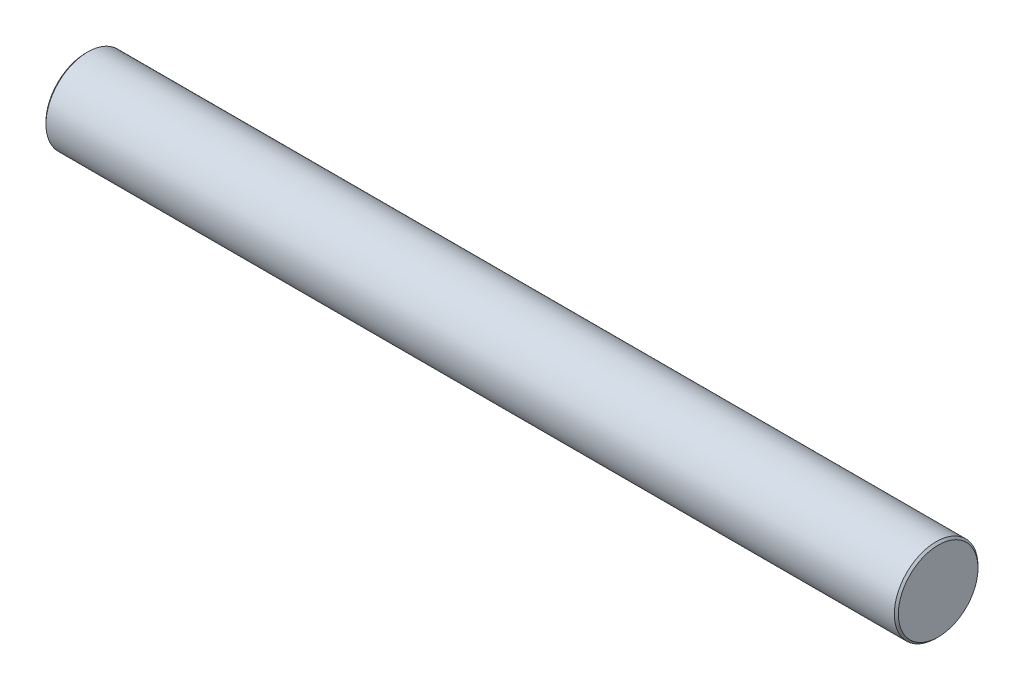
ISO-10303-21;
HEADER;
FILE_DESCRIPTION(('STEP AP214'),'2;1');
FILE_NAME('part.step','',(''),(''),'','','');
FILE_SCHEMA(('AUTOMOTIVE_DESIGN { 1 0 10303 214 1 1 1 1 }'));
ENDSEC;
DATA;
#1=APPLICATION_CONTEXT('core data for automotive mechanical design processes');
#2=APPLICATION_PROTOCOL_DEFINITION('international standard','automotive_design',2000,#1);
#3=PRODUCT_CONTEXT('',#1,'mechanical');
#4=PRODUCT('Part','Part','',(#3));
#5=PRODUCT_RELATED_PRODUCT_CATEGORY('part','',(#4));
#6=PRODUCT_DEFINITION_FORMATION('','',#4);
#7=PRODUCT_DEFINITION_CONTEXT('part definition',#1,'design');
#8=PRODUCT_DEFINITION('design','',#6,#7);
#9=PRODUCT_DEFINITION_SHAPE('','',#8);
#10=(LENGTH_UNIT() NAMED_UNIT(*) SI_UNIT(.MILLI.,.METRE.));
#11=(NAMED_UNIT(*) PLANE_ANGLE_UNIT() SI_UNIT($,.RADIAN.));
#12=(NAMED_UNIT(*) SI_UNIT($,.STERADIAN.) SOLID_ANGLE_UNIT());
#13=UNCERTAINTY_MEASURE_WITH_UNIT(LENGTH_MEASURE(1.E-05),#10,'distance_accuracy_value','');
#14=(GEOMETRIC_REPRESENTATION_CONTEXT(3) GLOBAL_UNCERTAINTY_ASSIGNED_CONTEXT((#13)) GLOBAL_UNIT_ASSIGNED_CONTEXT((#10,
#11,#12)) REPRESENTATION_CONTEXT('',''));
#15=CARTESIAN_POINT('',(0.,0.,0.));
#16=DIRECTION('',(0.,0.,1.));
#17=DIRECTION('',(1.,0.,0.));
#18=AXIS2_PLACEMENT_3D('',#15,#16,#17);
#19=CARTESIAN_POINT('',(161.925,0.,0.));
#20=DIRECTION('',(-1.,0.,0.));
#21=DIRECTION('',(0.,0.,1.));
#22=AXIS2_PLACEMENT_3D('',#19,#20,#21);
#23=CYLINDRICAL_SURFACE('',#22,15.9);
#24=CARTESIAN_POINT('',(161.163,0.,0.));
#25=DIRECTION('',(1.,0.,0.));
#26=DIRECTION('',(0.,0.,-1.));
#27=AXIS2_PLACEMENT_3D('',#24,#25,#26);
#28=CIRCLE('',#27,15.9);
#29=CARTESIAN_POINT('',(161.163,0.,-15.9));
#30=VERTEX_POINT('',#29);
#31=EDGE_CURVE('E47',#30,#30,#28,.F.);
#32=ORIENTED_EDGE('',*,*,#31,.T.);
#33=EDGE_LOOP('',(#32));
#34=FACE_BOUND('',#33,.T.);
#35=CARTESIAN_POINT('',(-161.163,0.,0.));
#36=DIRECTION('',(1.,0.,0.));
#37=DIRECTION('',(0.,0.,-1.));
#38=AXIS2_PLACEMENT_3D('',#35,#36,#37);
#39=CIRCLE('',#38,15.9);
#40=CARTESIAN_POINT('',(-161.163,0.,-15.9));
#41=VERTEX_POINT('',#40);
#42=EDGE_CURVE('E52',#41,#41,#39,.T.);
#43=ORIENTED_EDGE('',*,*,#42,.T.);
#44=EDGE_LOOP('',(#43));
#45=FACE_BOUND('',#44,.T.);
#46=ADVANCED_FACE('F38',(#34,#45),#23,.T.);
#47=CARTESIAN_POINT('',(161.925,0.,0.));
#48=DIRECTION('',(1.,0.,0.));
#49=DIRECTION('',(0.,0.,-1.));
#50=AXIS2_PLACEMENT_3D('',#47,#48,#49);
#51=PLANE('',#50);
#52=CARTESIAN_POINT('',(161.925,0.,0.));
#53=DIRECTION('',(1.,0.,0.));
#54=DIRECTION('',(0.,0.,-1.));
#55=AXIS2_PLACEMENT_3D('',#52,#53,#54);
#56=CIRCLE('',#55,15.138);
#57=CARTESIAN_POINT('',(161.925,0.,-15.138));
#58=VERTEX_POINT('',#57);
#59=EDGE_CURVE('E57',#58,#58,#56,.T.);
#60=ORIENTED_EDGE('',*,*,#59,.T.);
#61=EDGE_LOOP('',(#60));
#62=FACE_BOUND('',#61,.T.);
#63=ADVANCED_FACE('F64',(#62),#51,.T.);
#64=CARTESIAN_POINT('',(-161.925,0.,0.));
#65=DIRECTION('',(1.,0.,0.));
#66=DIRECTION('',(0.,0.,-1.));
#67=AXIS2_PLACEMENT_3D('',#64,#65,#66);
#68=PLANE('',#67);
#69=CARTESIAN_POINT('',(-161.925,0.,0.));
#70=DIRECTION('',(1.,0.,0.));
#71=DIRECTION('',(0.,0.,-1.));
#72=AXIS2_PLACEMENT_3D('',#69,#70,#71);
#73=CIRCLE('',#72,15.138);
#74=CARTESIAN_POINT('',(-161.925,0.,-15.138));
#75=VERTEX_POINT('',#74);
#76=EDGE_CURVE('E10',#75,#75,#73,.F.);
#77=ORIENTED_EDGE('',*,*,#76,.T.);
#78=EDGE_LOOP('',(#77));
#79=FACE_BOUND('',#78,.T.);
#80=ADVANCED_FACE('F68',(#79),#68,.F.);
#81=CARTESIAN_POINT('',(161.925,0.,0.));
#82=DIRECTION('',(-1.,0.,0.));
#83=DIRECTION('',(0.,0.,1.));
#84=AXIS2_PLACEMENT_3D('',#81,#82,#83);
#85=CONICAL_SURFACE('',#84,15.138,0.785398163397432);
#86=ORIENTED_EDGE('',*,*,#31,.F.);
#87=EDGE_LOOP('',(#86));
#88=FACE_BOUND('',#87,.T.);
#89=ORIENTED_EDGE('',*,*,#59,.F.);
#90=EDGE_LOOP('',(#89));
#91=FACE_BOUND('',#90,.T.);
#92=ADVANCED_FACE('F66',(#88,#91),#85,.T.);
#93=CARTESIAN_POINT('',(-161.163,0.,0.));
#94=DIRECTION('',(1.,0.,0.));
#95=DIRECTION('',(0.,0.,-1.));
#96=AXIS2_PLACEMENT_3D('',#93,#94,#95);
#97=CONICAL_SURFACE('',#96,15.9,0.785398163397451);
#98=ORIENTED_EDGE('',*,*,#76,.F.);
#99=EDGE_LOOP('',(#98));
#100=FACE_BOUND('',#99,.T.);
#101=ORIENTED_EDGE('',*,*,#42,.F.);
#102=EDGE_LOOP('',(#101));
#103=FACE_BOUND('',#102,.T.);
#104=ADVANCED_FACE('F41',(#100,#103),#97,.T.);
#105=CLOSED_SHELL('',(#46,#63,#80,#92,#104));
#106=MANIFOLD_SOLID_BREP('B2',#105);
#107=ADVANCED_BREP_SHAPE_REPRESENTATION('',(#18,#106),#14);
#108=SHAPE_DEFINITION_REPRESENTATION(#9,#107);
ENDSEC;
END-ISO-10303-21;
